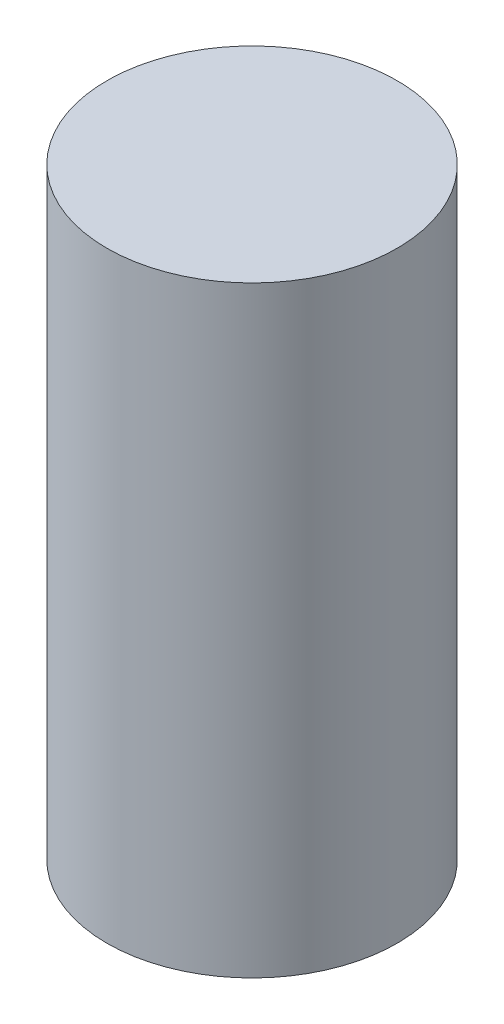
ISO-10303-21;
HEADER;
FILE_DESCRIPTION(('STEP AP214'),'2;1');
FILE_NAME('part.step','',(''),(''),'','','');
FILE_SCHEMA(('AUTOMOTIVE_DESIGN { 1 0 10303 214 1 1 1 1 }'));
ENDSEC;
DATA;
#1=APPLICATION_CONTEXT('core data for automotive mechanical design processes');
#2=APPLICATION_PROTOCOL_DEFINITION('international standard','automotive_design',2000,#1);
#3=PRODUCT_CONTEXT('',#1,'mechanical');
#4=PRODUCT('Part','Part','',(#3));
#5=PRODUCT_RELATED_PRODUCT_CATEGORY('part','',(#4));
#6=PRODUCT_DEFINITION_FORMATION('','',#4);
#7=PRODUCT_DEFINITION_CONTEXT('part definition',#1,'design');
#8=PRODUCT_DEFINITION('design','',#6,#7);
#9=PRODUCT_DEFINITION_SHAPE('','',#8);
#10=(LENGTH_UNIT() NAMED_UNIT(*) SI_UNIT(.MILLI.,.METRE.));
#11=(NAMED_UNIT(*) PLANE_ANGLE_UNIT() SI_UNIT($,.RADIAN.));
#12=(NAMED_UNIT(*) SI_UNIT($,.STERADIAN.) SOLID_ANGLE_UNIT());
#13=UNCERTAINTY_MEASURE_WITH_UNIT(LENGTH_MEASURE(1.E-05),#10,'distance_accuracy_value','');
#14=(GEOMETRIC_REPRESENTATION_CONTEXT(3) GLOBAL_UNCERTAINTY_ASSIGNED_CONTEXT((#13)) GLOBAL_UNIT_ASSIGNED_CONTEXT((#10,
#11,#12)) REPRESENTATION_CONTEXT('',''));
#15=CARTESIAN_POINT('',(0.,0.,0.));
#16=DIRECTION('',(0.,0.,1.));
#17=DIRECTION('',(1.,0.,0.));
#18=AXIS2_PLACEMENT_3D('',#15,#16,#17);
#19=CARTESIAN_POINT('',(0.,12.44,0.));
#20=DIRECTION('',(0.,-1.,0.));
#21=DIRECTION('',(0.,0.,-1.));
#22=AXIS2_PLACEMENT_3D('',#19,#20,#21);
#23=CYLINDRICAL_SURFACE('',#22,3.);
#24=CARTESIAN_POINT('',(0.,12.44,0.));
#25=DIRECTION('',(0.,1.,0.));
#26=DIRECTION('',(0.,0.,1.));
#27=AXIS2_PLACEMENT_3D('',#24,#25,#26);
#28=CIRCLE('',#27,3.);
#29=CARTESIAN_POINT('',(0.,12.44,3.));
#30=VERTEX_POINT('',#29);
#31=EDGE_CURVE('E10',#30,#30,#28,.T.);
#32=ORIENTED_EDGE('',*,*,#31,.F.);
#33=EDGE_LOOP('',(#32));
#34=FACE_BOUND('',#33,.T.);
#35=CARTESIAN_POINT('',(0.,0.,0.));
#36=DIRECTION('',(0.,1.,0.));
#37=DIRECTION('',(0.,0.,1.));
#38=AXIS2_PLACEMENT_3D('',#35,#36,#37);
#39=CIRCLE('',#38,3.);
#40=CARTESIAN_POINT('',(0.,0.,3.));
#41=VERTEX_POINT('',#40);
#42=EDGE_CURVE('E38',#41,#41,#39,.T.);
#43=ORIENTED_EDGE('',*,*,#42,.T.);
#44=EDGE_LOOP('',(#43));
#45=FACE_BOUND('',#44,.T.);
#46=ADVANCED_FACE('F35',(#34,#45),#23,.T.);
#47=CARTESIAN_POINT('',(0.,12.44,0.));
#48=DIRECTION('',(0.,1.,0.));
#49=DIRECTION('',(0.,0.,1.));
#50=AXIS2_PLACEMENT_3D('',#47,#48,#49);
#51=PLANE('',#50);
#52=ORIENTED_EDGE('',*,*,#31,.T.);
#53=EDGE_LOOP('',(#52));
#54=FACE_BOUND('',#53,.T.);
#55=ADVANCED_FACE('F50',(#54),#51,.T.);
#56=CARTESIAN_POINT('',(0.,0.,0.));
#57=DIRECTION('',(0.,1.,0.));
#58=DIRECTION('',(0.,0.,1.));
#59=AXIS2_PLACEMENT_3D('',#56,#57,#58);
#60=PLANE('',#59);
#61=ORIENTED_EDGE('',*,*,#42,.F.);
#62=EDGE_LOOP('',(#61));
#63=FACE_BOUND('',#62,.T.);
#64=ADVANCED_FACE('F48',(#63),#60,.F.);
#65=CLOSED_SHELL('',(#46,#55,#64));
#66=MANIFOLD_SOLID_BREP('B2',#65);
#67=ADVANCED_BREP_SHAPE_REPRESENTATION('',(#18,#66),#14);
#68=SHAPE_DEFINITION_REPRESENTATION(#9,#67);
ENDSEC;
END-ISO-10303-21;
